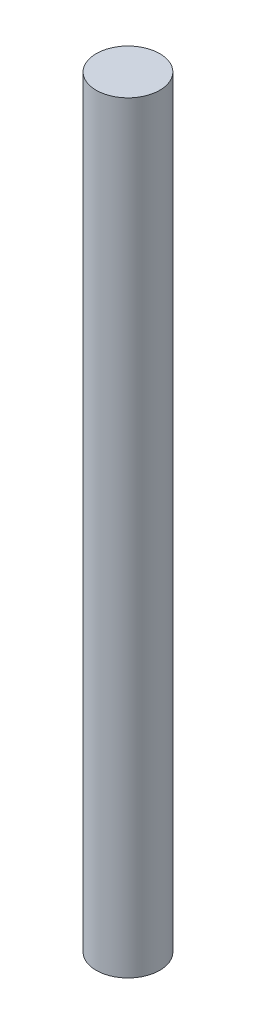
ISO-10303-21;
HEADER;
FILE_DESCRIPTION(('STEP AP214'),'2;1');
FILE_NAME('part.step','',(''),(''),'','','');
FILE_SCHEMA(('AUTOMOTIVE_DESIGN { 1 0 10303 214 1 1 1 1 }'));
ENDSEC;
DATA;
#1=APPLICATION_CONTEXT('core data for automotive mechanical design processes');
#2=APPLICATION_PROTOCOL_DEFINITION('international standard','automotive_design',2000,#1);
#3=PRODUCT_CONTEXT('',#1,'mechanical');
#4=PRODUCT('Part','Part','',(#3));
#5=PRODUCT_RELATED_PRODUCT_CATEGORY('part','',(#4));
#6=PRODUCT_DEFINITION_FORMATION('','',#4);
#7=PRODUCT_DEFINITION_CONTEXT('part definition',#1,'design');
#8=PRODUCT_DEFINITION('design','',#6,#7);
#9=PRODUCT_DEFINITION_SHAPE('','',#8);
#10=(LENGTH_UNIT() NAMED_UNIT(*) SI_UNIT(.MILLI.,.METRE.));
#11=(NAMED_UNIT(*) PLANE_ANGLE_UNIT() SI_UNIT($,.RADIAN.));
#12=(NAMED_UNIT(*) SI_UNIT($,.STERADIAN.) SOLID_ANGLE_UNIT());
#13=UNCERTAINTY_MEASURE_WITH_UNIT(LENGTH_MEASURE(1.E-05),#10,'distance_accuracy_value','');
#14=(GEOMETRIC_REPRESENTATION_CONTEXT(3) GLOBAL_UNCERTAINTY_ASSIGNED_CONTEXT((#13)) GLOBAL_UNIT_ASSIGNED_CONTEXT((#10,
#11,#12)) REPRESENTATION_CONTEXT('',''));
#15=CARTESIAN_POINT('',(0.,0.,0.));
#16=DIRECTION('',(0.,0.,1.));
#17=DIRECTION('',(1.,0.,0.));
#18=AXIS2_PLACEMENT_3D('',#15,#16,#17);
#19=CARTESIAN_POINT('',(0.,120.,0.));
#20=DIRECTION('',(0.,-1.,0.));
#21=DIRECTION('',(0.,0.,-1.));
#22=AXIS2_PLACEMENT_3D('',#19,#20,#21);
#23=CYLINDRICAL_SURFACE('',#22,5.);
#24=CARTESIAN_POINT('',(0.,120.,0.));
#25=DIRECTION('',(0.,1.,0.));
#26=DIRECTION('',(0.,0.,1.));
#27=AXIS2_PLACEMENT_3D('',#24,#25,#26);
#28=CIRCLE('',#27,5.);
#29=CARTESIAN_POINT('',(0.,120.,5.));
#30=VERTEX_POINT('',#29);
#31=EDGE_CURVE('E10',#30,#30,#28,.T.);
#32=ORIENTED_EDGE('',*,*,#31,.F.);
#33=EDGE_LOOP('',(#32));
#34=FACE_BOUND('',#33,.T.);
#35=CARTESIAN_POINT('',(0.,0.,0.));
#36=DIRECTION('',(0.,1.,0.));
#37=DIRECTION('',(0.,0.,1.));
#38=AXIS2_PLACEMENT_3D('',#35,#36,#37);
#39=CIRCLE('',#38,5.);
#40=CARTESIAN_POINT('',(0.,0.,5.));
#41=VERTEX_POINT('',#40);
#42=EDGE_CURVE('E37',#41,#41,#39,.T.);
#43=ORIENTED_EDGE('',*,*,#42,.T.);
#44=EDGE_LOOP('',(#43));
#45=FACE_BOUND('',#44,.T.);
#46=ADVANCED_FACE('F40',(#34,#45),#23,.T.);
#47=CARTESIAN_POINT('',(0.,120.,0.));
#48=DIRECTION('',(0.,1.,0.));
#49=DIRECTION('',(0.,0.,1.));
#50=AXIS2_PLACEMENT_3D('',#47,#48,#49);
#51=PLANE('',#50);
#52=ORIENTED_EDGE('',*,*,#31,.T.);
#53=EDGE_LOOP('',(#52));
#54=FACE_BOUND('',#53,.T.);
#55=ADVANCED_FACE('F55',(#54),#51,.T.);
#56=CARTESIAN_POINT('',(0.,0.,0.));
#57=DIRECTION('',(0.,1.,0.));
#58=DIRECTION('',(0.,0.,1.));
#59=AXIS2_PLACEMENT_3D('',#56,#57,#58);
#60=PLANE('',#59);
#61=ORIENTED_EDGE('',*,*,#42,.F.);
#62=EDGE_LOOP('',(#61));
#63=FACE_BOUND('',#62,.T.);
#64=ADVANCED_FACE('F49',(#63),#60,.F.);
#65=CLOSED_SHELL('',(#46,#55,#64));
#66=MANIFOLD_SOLID_BREP('B2',#65);
#67=ADVANCED_BREP_SHAPE_REPRESENTATION('',(#18,#66),#14);
#68=SHAPE_DEFINITION_REPRESENTATION(#9,#67);
ENDSEC;
END-ISO-10303-21;
